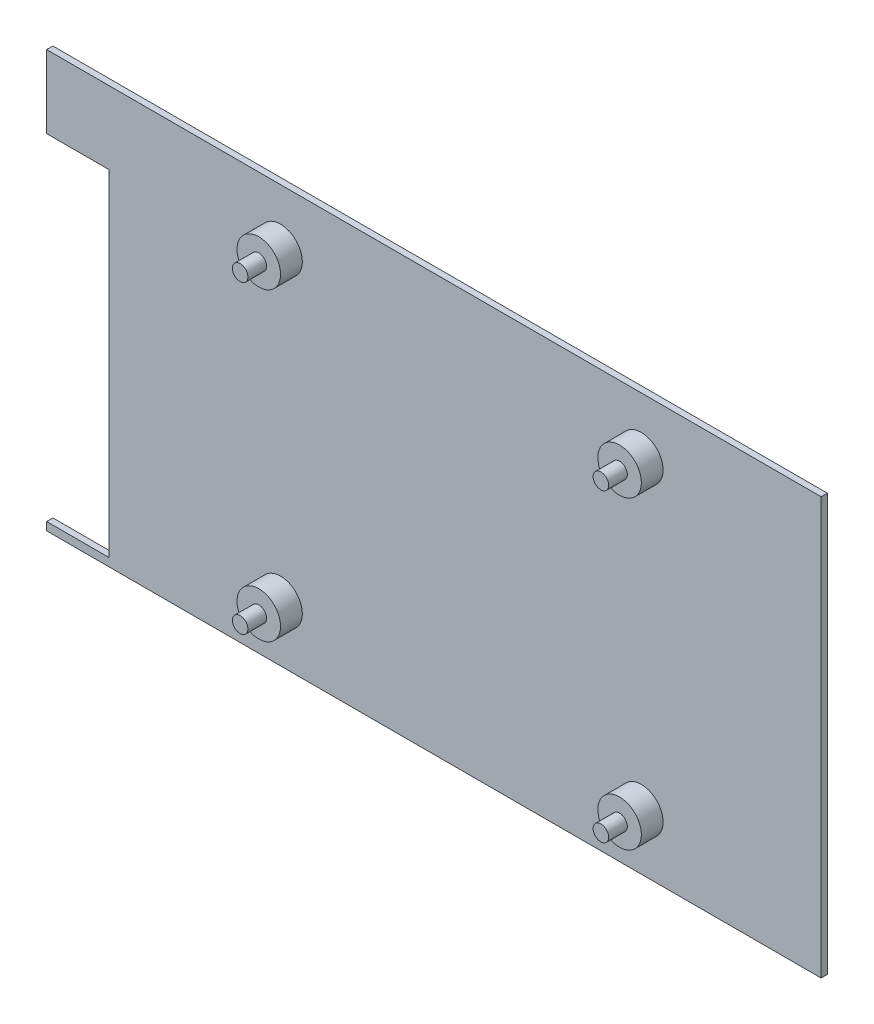
ISO-10303-21;
HEADER;
FILE_DESCRIPTION(('STEP AP214'),'2;1');
FILE_NAME('part.step','',(''),(''),'','','');
FILE_SCHEMA(('AUTOMOTIVE_DESIGN { 1 0 10303 214 1 1 1 1 }'));
ENDSEC;
DATA;
#1=APPLICATION_CONTEXT('core data for automotive mechanical design processes');
#2=APPLICATION_PROTOCOL_DEFINITION('international standard','automotive_design',2000,#1);
#3=PRODUCT_CONTEXT('',#1,'mechanical');
#4=PRODUCT('Part','Part','',(#3));
#5=PRODUCT_RELATED_PRODUCT_CATEGORY('part','',(#4));
#6=PRODUCT_DEFINITION_FORMATION('','',#4);
#7=PRODUCT_DEFINITION_CONTEXT('part definition',#1,'design');
#8=PRODUCT_DEFINITION('design','',#6,#7);
#9=PRODUCT_DEFINITION_SHAPE('','',#8);
#10=(LENGTH_UNIT() NAMED_UNIT(*) SI_UNIT(.MILLI.,.METRE.));
#11=(NAMED_UNIT(*) PLANE_ANGLE_UNIT() SI_UNIT($,.RADIAN.));
#12=(NAMED_UNIT(*) SI_UNIT($,.STERADIAN.) SOLID_ANGLE_UNIT());
#13=UNCERTAINTY_MEASURE_WITH_UNIT(LENGTH_MEASURE(1.E-05),#10,'distance_accuracy_value','');
#14=(GEOMETRIC_REPRESENTATION_CONTEXT(3) GLOBAL_UNCERTAINTY_ASSIGNED_CONTEXT((#13)) GLOBAL_UNIT_ASSIGNED_CONTEXT((#10,
#11,#12)) REPRESENTATION_CONTEXT('',''));
#15=CARTESIAN_POINT('',(0.,0.,0.));
#16=DIRECTION('',(0.,0.,1.));
#17=DIRECTION('',(1.,0.,0.));
#18=AXIS2_PLACEMENT_3D('',#15,#16,#17);
#19=CARTESIAN_POINT('',(-24.25,-24.5,4.5));
#20=DIRECTION('',(0.,0.,1.));
#21=DIRECTION('',(1.,0.,0.));
#22=AXIS2_PLACEMENT_3D('',#19,#20,#21);
#23=PLANE('',#22);
#24=CARTESIAN_POINT('',(-24.25,-24.5,4.5));
#25=DIRECTION('',(0.,0.,1.));
#26=DIRECTION('',(1.,0.,0.));
#27=AXIS2_PLACEMENT_3D('',#24,#25,#26);
#28=CIRCLE('',#27,3.5);
#29=CARTESIAN_POINT('',(-20.75,-24.5,4.5));
#30=VERTEX_POINT('',#29);
#31=EDGE_CURVE('E270',#30,#30,#28,.T.);
#32=ORIENTED_EDGE('',*,*,#31,.T.);
#33=EDGE_LOOP('',(#32));
#34=FACE_BOUND('',#33,.T.);
#35=CARTESIAN_POINT('',(-24.25,-24.5,4.5));
#36=DIRECTION('',(0.,0.,1.));
#37=DIRECTION('',(1.,0.,0.));
#38=AXIS2_PLACEMENT_3D('',#35,#36,#37);
#39=CIRCLE('',#38,1.25);
#40=CARTESIAN_POINT('',(-23.,-24.5,4.5));
#41=VERTEX_POINT('',#40);
#42=EDGE_CURVE('E250',#41,#41,#39,.T.);
#43=ORIENTED_EDGE('',*,*,#42,.F.);
#44=EDGE_LOOP('',(#43));
#45=FACE_BOUND('',#44,.T.);
#46=ADVANCED_FACE('F44',(#34,#45),#23,.T.);
#47=CARTESIAN_POINT('',(33.75,-24.5,4.5));
#48=DIRECTION('',(0.,0.,1.));
#49=DIRECTION('',(1.,0.,0.));
#50=AXIS2_PLACEMENT_3D('',#47,#48,#49);
#51=PLANE('',#50);
#52=CARTESIAN_POINT('',(33.75,-24.5,4.5));
#53=DIRECTION('',(0.,0.,1.));
#54=DIRECTION('',(1.,0.,0.));
#55=AXIS2_PLACEMENT_3D('',#52,#53,#54);
#56=CIRCLE('',#55,3.5);
#57=CARTESIAN_POINT('',(37.25,-24.5,4.5));
#58=VERTEX_POINT('',#57);
#59=EDGE_CURVE('E274',#58,#58,#56,.T.);
#60=ORIENTED_EDGE('',*,*,#59,.T.);
#61=EDGE_LOOP('',(#60));
#62=FACE_BOUND('',#61,.T.);
#63=CARTESIAN_POINT('',(33.75,-24.5,4.5));
#64=DIRECTION('',(0.,0.,1.));
#65=DIRECTION('',(1.,0.,0.));
#66=AXIS2_PLACEMENT_3D('',#63,#64,#65);
#67=CIRCLE('',#66,1.25);
#68=CARTESIAN_POINT('',(35.,-24.5,4.5));
#69=VERTEX_POINT('',#68);
#70=EDGE_CURVE('E249',#69,#69,#67,.T.);
#71=ORIENTED_EDGE('',*,*,#70,.F.);
#72=EDGE_LOOP('',(#71));
#73=FACE_BOUND('',#72,.T.);
#74=ADVANCED_FACE('F208',(#62,#73),#51,.T.);
#75=CARTESIAN_POINT('',(33.75,24.5,4.5));
#76=DIRECTION('',(0.,0.,1.));
#77=DIRECTION('',(1.,0.,0.));
#78=AXIS2_PLACEMENT_3D('',#75,#76,#77);
#79=PLANE('',#78);
#80=CARTESIAN_POINT('',(33.75,24.5,4.5));
#81=DIRECTION('',(0.,0.,1.));
#82=DIRECTION('',(1.,0.,0.));
#83=AXIS2_PLACEMENT_3D('',#80,#81,#82);
#84=CIRCLE('',#83,3.5);
#85=CARTESIAN_POINT('',(37.25,24.5,4.5));
#86=VERTEX_POINT('',#85);
#87=EDGE_CURVE('E277',#86,#86,#84,.T.);
#88=ORIENTED_EDGE('',*,*,#87,.T.);
#89=EDGE_LOOP('',(#88));
#90=FACE_BOUND('',#89,.T.);
#91=CARTESIAN_POINT('',(33.75,24.5,4.5));
#92=DIRECTION('',(0.,0.,1.));
#93=DIRECTION('',(1.,0.,0.));
#94=AXIS2_PLACEMENT_3D('',#91,#92,#93);
#95=CIRCLE('',#94,1.25);
#96=CARTESIAN_POINT('',(35.,24.5,4.5));
#97=VERTEX_POINT('',#96);
#98=EDGE_CURVE('E259',#97,#97,#95,.T.);
#99=ORIENTED_EDGE('',*,*,#98,.F.);
#100=EDGE_LOOP('',(#99));
#101=FACE_BOUND('',#100,.T.);
#102=ADVANCED_FACE('F213',(#90,#101),#79,.T.);
#103=CARTESIAN_POINT('',(-24.25,24.5,4.5));
#104=DIRECTION('',(0.,0.,1.));
#105=DIRECTION('',(1.,0.,0.));
#106=AXIS2_PLACEMENT_3D('',#103,#104,#105);
#107=PLANE('',#106);
#108=CARTESIAN_POINT('',(-24.25,24.5,4.5));
#109=DIRECTION('',(0.,0.,1.));
#110=DIRECTION('',(1.,0.,0.));
#111=AXIS2_PLACEMENT_3D('',#108,#109,#110);
#112=CIRCLE('',#111,3.5);
#113=CARTESIAN_POINT('',(-20.75,24.5,4.5));
#114=VERTEX_POINT('',#113);
#115=EDGE_CURVE('E147',#114,#114,#112,.T.);
#116=ORIENTED_EDGE('',*,*,#115,.T.);
#117=EDGE_LOOP('',(#116));
#118=FACE_BOUND('',#117,.T.);
#119=CARTESIAN_POINT('',(-24.25,24.5,4.5));
#120=DIRECTION('',(0.,0.,1.));
#121=DIRECTION('',(1.,0.,0.));
#122=AXIS2_PLACEMENT_3D('',#119,#120,#121);
#123=CIRCLE('',#122,1.25);
#124=CARTESIAN_POINT('',(-23.,24.5,4.5));
#125=VERTEX_POINT('',#124);
#126=EDGE_CURVE('E264',#125,#125,#123,.T.);
#127=ORIENTED_EDGE('',*,*,#126,.F.);
#128=EDGE_LOOP('',(#127));
#129=FACE_BOUND('',#128,.T.);
#130=ADVANCED_FACE('F185',(#118,#129),#107,.T.);
#131=CARTESIAN_POINT('',(0.,0.,1.));
#132=DIRECTION('',(0.,0.,-1.));
#133=DIRECTION('',(-1.,0.,0.));
#134=AXIS2_PLACEMENT_3D('',#131,#132,#133);
#135=PLANE('',#134);
#136=DIRECTION('',(0.,-1.,0.));
#137=VECTOR('',#136,1.);
#138=CARTESIAN_POINT('',(-61.85,-32.2,1.));
#139=LINE('',#138,#137);
#140=CARTESIAN_POINT('',(-61.85,-32.2,1.));
#141=VERTEX_POINT('',#140);
#142=CARTESIAN_POINT('',(-61.85,-33.5,1.));
#143=VERTEX_POINT('',#142);
#144=EDGE_CURVE('E158',#141,#143,#139,.T.);
#145=ORIENTED_EDGE('',*,*,#144,.T.);
#146=DIRECTION('',(1.,0.,0.));
#147=VECTOR('',#146,1.);
#148=CARTESIAN_POINT('',(62.65,-33.5,1.));
#149=LINE('',#148,#147);
#150=CARTESIAN_POINT('',(62.65,-33.5,1.));
#151=VERTEX_POINT('',#150);
#152=EDGE_CURVE('E105',#143,#151,#149,.T.);
#153=ORIENTED_EDGE('',*,*,#152,.T.);
#154=DIRECTION('',(0.,1.,0.));
#155=VECTOR('',#154,1.);
#156=CARTESIAN_POINT('',(62.65,33.5,1.));
#157=LINE('',#156,#155);
#158=CARTESIAN_POINT('',(62.65,33.5,1.));
#159=VERTEX_POINT('',#158);
#160=EDGE_CURVE('E284',#151,#159,#157,.T.);
#161=ORIENTED_EDGE('',*,*,#160,.T.);
#162=DIRECTION('',(-1.,0.,0.));
#163=VECTOR('',#162,1.);
#164=CARTESIAN_POINT('',(62.65,33.5,1.));
#165=LINE('',#164,#163);
#166=CARTESIAN_POINT('',(-61.85,33.5,1.));
#167=VERTEX_POINT('',#166);
#168=EDGE_CURVE('E286',#159,#167,#165,.T.);
#169=ORIENTED_EDGE('',*,*,#168,.T.);
#170=DIRECTION('',(0.,-1.,0.));
#171=VECTOR('',#170,1.);
#172=CARTESIAN_POINT('',(-61.85,33.5,1.));
#173=LINE('',#172,#171);
#174=CARTESIAN_POINT('',(-61.85,21.8,1.));
#175=VERTEX_POINT('',#174);
#176=EDGE_CURVE('E125',#167,#175,#173,.T.);
#177=ORIENTED_EDGE('',*,*,#176,.T.);
#178=DIRECTION('',(1.,0.,0.));
#179=VECTOR('',#178,1.);
#180=CARTESIAN_POINT('',(-61.85,21.8,1.));
#181=LINE('',#180,#179);
#182=CARTESIAN_POINT('',(-51.85,21.8,1.));
#183=VERTEX_POINT('',#182);
#184=EDGE_CURVE('E118',#175,#183,#181,.T.);
#185=ORIENTED_EDGE('',*,*,#184,.T.);
#186=DIRECTION('',(0.,-1.,0.));
#187=VECTOR('',#186,1.);
#188=CARTESIAN_POINT('',(-51.85,21.8,1.));
#189=LINE('',#188,#187);
#190=CARTESIAN_POINT('',(-51.85,-32.2,1.));
#191=VERTEX_POINT('',#190);
#192=EDGE_CURVE('E123',#183,#191,#189,.T.);
#193=ORIENTED_EDGE('',*,*,#192,.T.);
#194=DIRECTION('',(-1.,0.,0.));
#195=VECTOR('',#194,1.);
#196=CARTESIAN_POINT('',(-51.85,-32.2,1.));
#197=LINE('',#196,#195);
#198=EDGE_CURVE('E61',#191,#141,#197,.T.);
#199=ORIENTED_EDGE('',*,*,#198,.T.);
#200=EDGE_LOOP('',(#145,#153,#161,#169,#177,#185,#193,#199));
#201=FACE_BOUND('',#200,.T.);
#202=CARTESIAN_POINT('',(-24.25,24.5,1.));
#203=DIRECTION('',(0.,0.,-1.));
#204=DIRECTION('',(-1.,0.,0.));
#205=AXIS2_PLACEMENT_3D('',#202,#203,#204);
#206=CIRCLE('',#205,3.5);
#207=CARTESIAN_POINT('',(-27.75,24.5,1.));
#208=VERTEX_POINT('',#207);
#209=EDGE_CURVE('E173',#208,#208,#206,.F.);
#210=ORIENTED_EDGE('',*,*,#209,.F.);
#211=EDGE_LOOP('',(#210));
#212=FACE_BOUND('',#211,.T.);
#213=CARTESIAN_POINT('',(33.75,24.5,1.));
#214=DIRECTION('',(0.,0.,-1.));
#215=DIRECTION('',(-1.,0.,0.));
#216=AXIS2_PLACEMENT_3D('',#213,#214,#215);
#217=CIRCLE('',#216,3.5);
#218=CARTESIAN_POINT('',(30.25,24.5,1.));
#219=VERTEX_POINT('',#218);
#220=EDGE_CURVE('E176',#219,#219,#217,.F.);
#221=ORIENTED_EDGE('',*,*,#220,.F.);
#222=EDGE_LOOP('',(#221));
#223=FACE_BOUND('',#222,.T.);
#224=CARTESIAN_POINT('',(33.75,-24.5,1.));
#225=DIRECTION('',(0.,0.,-1.));
#226=DIRECTION('',(-1.,0.,0.));
#227=AXIS2_PLACEMENT_3D('',#224,#225,#226);
#228=CIRCLE('',#227,3.5);
#229=CARTESIAN_POINT('',(30.25,-24.5,1.));
#230=VERTEX_POINT('',#229);
#231=EDGE_CURVE('E53',#230,#230,#228,.F.);
#232=ORIENTED_EDGE('',*,*,#231,.F.);
#233=EDGE_LOOP('',(#232));
#234=FACE_BOUND('',#233,.T.);
#235=CARTESIAN_POINT('',(-24.25,-24.5,1.));
#236=DIRECTION('',(0.,0.,-1.));
#237=DIRECTION('',(-1.,0.,0.));
#238=AXIS2_PLACEMENT_3D('',#235,#236,#237);
#239=CIRCLE('',#238,3.5);
#240=CARTESIAN_POINT('',(-27.75,-24.5,1.));
#241=VERTEX_POINT('',#240);
#242=EDGE_CURVE('E13',#241,#241,#239,.F.);
#243=ORIENTED_EDGE('',*,*,#242,.F.);
#244=EDGE_LOOP('',(#243));
#245=FACE_BOUND('',#244,.T.);
#246=ADVANCED_FACE('F120',(#201,#212,#223,#234,#245),#135,.F.);
#247=CARTESIAN_POINT('',(-61.85,-32.2,1.));
#248=DIRECTION('',(1.,0.,0.));
#249=DIRECTION('',(0.,1.,0.));
#250=AXIS2_PLACEMENT_3D('',#247,#248,#249);
#251=PLANE('',#250);
#252=DIRECTION('',(0.,-1.,0.));
#253=VECTOR('',#252,1.);
#254=CARTESIAN_POINT('',(-61.85,-32.2,0.));
#255=LINE('',#254,#253);
#256=CARTESIAN_POINT('',(-61.85,-32.2,0.));
#257=VERTEX_POINT('',#256);
#258=CARTESIAN_POINT('',(-61.85,-33.5,0.));
#259=VERTEX_POINT('',#258);
#260=EDGE_CURVE('E143',#257,#259,#255,.T.);
#261=ORIENTED_EDGE('',*,*,#260,.T.);
#262=DIRECTION('',(0.,0.,-1.));
#263=VECTOR('',#262,1.);
#264=CARTESIAN_POINT('',(-61.85,-33.5,1.));
#265=LINE('',#264,#263);
#266=EDGE_CURVE('E171',#143,#259,#265,.T.);
#267=ORIENTED_EDGE('',*,*,#266,.F.);
#268=ORIENTED_EDGE('',*,*,#144,.F.);
#269=DIRECTION('',(0.,0.,-1.));
#270=VECTOR('',#269,1.);
#271=CARTESIAN_POINT('',(-61.85,-32.2,1.));
#272=LINE('',#271,#270);
#273=EDGE_CURVE('E139',#141,#257,#272,.T.);
#274=ORIENTED_EDGE('',*,*,#273,.T.);
#275=EDGE_LOOP('',(#261,#267,#268,#274));
#276=FACE_BOUND('',#275,.T.);
#277=ADVANCED_FACE('F46',(#276),#251,.F.);
#278=CARTESIAN_POINT('',(62.65,-33.5,1.));
#279=DIRECTION('',(0.,1.,0.));
#280=DIRECTION('',(-1.,0.,0.));
#281=AXIS2_PLACEMENT_3D('',#278,#279,#280);
#282=PLANE('',#281);
#283=DIRECTION('',(1.,0.,0.));
#284=VECTOR('',#283,1.);
#285=CARTESIAN_POINT('',(62.65,-33.5,0.));
#286=LINE('',#285,#284);
#287=CARTESIAN_POINT('',(62.65,-33.5,0.));
#288=VERTEX_POINT('',#287);
#289=EDGE_CURVE('E146',#259,#288,#286,.T.);
#290=ORIENTED_EDGE('',*,*,#289,.T.);
#291=DIRECTION('',(0.,0.,-1.));
#292=VECTOR('',#291,1.);
#293=CARTESIAN_POINT('',(62.65,-33.5,1.));
#294=LINE('',#293,#292);
#295=EDGE_CURVE('E168',#151,#288,#294,.T.);
#296=ORIENTED_EDGE('',*,*,#295,.F.);
#297=ORIENTED_EDGE('',*,*,#152,.F.);
#298=ORIENTED_EDGE('',*,*,#266,.T.);
#299=EDGE_LOOP('',(#290,#296,#297,#298));
#300=FACE_BOUND('',#299,.T.);
#301=ADVANCED_FACE('F323',(#300),#282,.F.);
#302=CARTESIAN_POINT('',(62.65,33.5,1.));
#303=DIRECTION('',(-1.,0.,0.));
#304=DIRECTION('',(0.,-1.,0.));
#305=AXIS2_PLACEMENT_3D('',#302,#303,#304);
#306=PLANE('',#305);
#307=DIRECTION('',(0.,1.,0.));
#308=VECTOR('',#307,1.);
#309=CARTESIAN_POINT('',(62.65,33.5,0.));
#310=LINE('',#309,#308);
#311=CARTESIAN_POINT('',(62.65,33.5,0.));
#312=VERTEX_POINT('',#311);
#313=EDGE_CURVE('E149',#288,#312,#310,.T.);
#314=ORIENTED_EDGE('',*,*,#313,.T.);
#315=DIRECTION('',(0.,0.,-1.));
#316=VECTOR('',#315,1.);
#317=CARTESIAN_POINT('',(62.65,33.5,1.));
#318=LINE('',#317,#316);
#319=EDGE_CURVE('E165',#159,#312,#318,.T.);
#320=ORIENTED_EDGE('',*,*,#319,.F.);
#321=ORIENTED_EDGE('',*,*,#160,.F.);
#322=ORIENTED_EDGE('',*,*,#295,.T.);
#323=EDGE_LOOP('',(#314,#320,#321,#322));
#324=FACE_BOUND('',#323,.T.);
#325=ADVANCED_FACE('F321',(#324),#306,.F.);
#326=CARTESIAN_POINT('',(62.65,33.5,1.));
#327=DIRECTION('',(0.,-1.,0.));
#328=DIRECTION('',(1.,0.,0.));
#329=AXIS2_PLACEMENT_3D('',#326,#327,#328);
#330=PLANE('',#329);
#331=DIRECTION('',(-1.,0.,0.));
#332=VECTOR('',#331,1.);
#333=CARTESIAN_POINT('',(62.65,33.5,0.));
#334=LINE('',#333,#332);
#335=CARTESIAN_POINT('',(-61.85,33.5,0.));
#336=VERTEX_POINT('',#335);
#337=EDGE_CURVE('E151',#312,#336,#334,.T.);
#338=ORIENTED_EDGE('',*,*,#337,.T.);
#339=DIRECTION('',(0.,0.,-1.));
#340=VECTOR('',#339,1.);
#341=CARTESIAN_POINT('',(-61.85,33.5,1.));
#342=LINE('',#341,#340);
#343=EDGE_CURVE('E162',#167,#336,#342,.T.);
#344=ORIENTED_EDGE('',*,*,#343,.F.);
#345=ORIENTED_EDGE('',*,*,#168,.F.);
#346=ORIENTED_EDGE('',*,*,#319,.T.);
#347=EDGE_LOOP('',(#338,#344,#345,#346));
#348=FACE_BOUND('',#347,.T.);
#349=ADVANCED_FACE('F292',(#348),#330,.F.);
#350=CARTESIAN_POINT('',(-61.85,33.5,1.));
#351=DIRECTION('',(1.,0.,0.));
#352=DIRECTION('',(0.,1.,0.));
#353=AXIS2_PLACEMENT_3D('',#350,#351,#352);
#354=PLANE('',#353);
#355=DIRECTION('',(0.,-1.,0.));
#356=VECTOR('',#355,1.);
#357=CARTESIAN_POINT('',(-61.85,33.5,0.));
#358=LINE('',#357,#356);
#359=CARTESIAN_POINT('',(-61.85,21.8,0.));
#360=VERTEX_POINT('',#359);
#361=EDGE_CURVE('E153',#336,#360,#358,.T.);
#362=ORIENTED_EDGE('',*,*,#361,.T.);
#363=DIRECTION('',(0.,0.,-1.));
#364=VECTOR('',#363,1.);
#365=CARTESIAN_POINT('',(-61.85,21.8,1.));
#366=LINE('',#365,#364);
#367=EDGE_CURVE('E134',#175,#360,#366,.T.);
#368=ORIENTED_EDGE('',*,*,#367,.F.);
#369=ORIENTED_EDGE('',*,*,#176,.F.);
#370=ORIENTED_EDGE('',*,*,#343,.T.);
#371=EDGE_LOOP('',(#362,#368,#369,#370));
#372=FACE_BOUND('',#371,.T.);
#373=ADVANCED_FACE('F296',(#372),#354,.F.);
#374=CARTESIAN_POINT('',(-61.85,21.8,1.));
#375=DIRECTION('',(0.,1.,0.));
#376=DIRECTION('',(-1.,0.,0.));
#377=AXIS2_PLACEMENT_3D('',#374,#375,#376);
#378=PLANE('',#377);
#379=DIRECTION('',(1.,0.,0.));
#380=VECTOR('',#379,1.);
#381=CARTESIAN_POINT('',(-61.85,21.8,0.));
#382=LINE('',#381,#380);
#383=CARTESIAN_POINT('',(-51.85,21.8,0.));
#384=VERTEX_POINT('',#383);
#385=EDGE_CURVE('E133',#360,#384,#382,.T.);
#386=ORIENTED_EDGE('',*,*,#385,.T.);
#387=DIRECTION('',(0.,0.,-1.));
#388=VECTOR('',#387,1.);
#389=CARTESIAN_POINT('',(-51.85,21.8,1.));
#390=LINE('',#389,#388);
#391=EDGE_CURVE('E130',#183,#384,#390,.T.);
#392=ORIENTED_EDGE('',*,*,#391,.F.);
#393=ORIENTED_EDGE('',*,*,#184,.F.);
#394=ORIENTED_EDGE('',*,*,#367,.T.);
#395=EDGE_LOOP('',(#386,#392,#393,#394));
#396=FACE_BOUND('',#395,.T.);
#397=ADVANCED_FACE('F131',(#396),#378,.F.);
#398=CARTESIAN_POINT('',(-51.85,21.8,1.));
#399=DIRECTION('',(1.,0.,0.));
#400=DIRECTION('',(0.,1.,0.));
#401=AXIS2_PLACEMENT_3D('',#398,#399,#400);
#402=PLANE('',#401);
#403=DIRECTION('',(0.,-1.,0.));
#404=VECTOR('',#403,1.);
#405=CARTESIAN_POINT('',(-51.85,21.8,0.));
#406=LINE('',#405,#404);
#407=CARTESIAN_POINT('',(-51.85,-32.2,0.));
#408=VERTEX_POINT('',#407);
#409=EDGE_CURVE('E90',#384,#408,#406,.T.);
#410=ORIENTED_EDGE('',*,*,#409,.T.);
#411=DIRECTION('',(0.,0.,-1.));
#412=VECTOR('',#411,1.);
#413=CARTESIAN_POINT('',(-51.85,-32.2,1.));
#414=LINE('',#413,#412);
#415=EDGE_CURVE('E135',#191,#408,#414,.T.);
#416=ORIENTED_EDGE('',*,*,#415,.F.);
#417=ORIENTED_EDGE('',*,*,#192,.F.);
#418=ORIENTED_EDGE('',*,*,#391,.T.);
#419=EDGE_LOOP('',(#410,#416,#417,#418));
#420=FACE_BOUND('',#419,.T.);
#421=ADVANCED_FACE('F137',(#420),#402,.F.);
#422=CARTESIAN_POINT('',(-51.85,-32.2,1.));
#423=DIRECTION('',(0.,-1.,0.));
#424=DIRECTION('',(0.,0.,-1.));
#425=AXIS2_PLACEMENT_3D('',#422,#423,#424);
#426=PLANE('',#425);
#427=DIRECTION('',(-1.,0.,0.));
#428=VECTOR('',#427,1.);
#429=CARTESIAN_POINT('',(-51.85,-32.2,0.));
#430=LINE('',#429,#428);
#431=EDGE_CURVE('E96',#408,#257,#430,.T.);
#432=ORIENTED_EDGE('',*,*,#431,.T.);
#433=ORIENTED_EDGE('',*,*,#273,.F.);
#434=ORIENTED_EDGE('',*,*,#198,.F.);
#435=ORIENTED_EDGE('',*,*,#415,.T.);
#436=EDGE_LOOP('',(#432,#433,#434,#435));
#437=FACE_BOUND('',#436,.T.);
#438=ADVANCED_FACE('F304',(#437),#426,.F.);
#439=CARTESIAN_POINT('',(0.,0.,0.));
#440=DIRECTION('',(0.,0.,-1.));
#441=DIRECTION('',(-1.,0.,0.));
#442=AXIS2_PLACEMENT_3D('',#439,#440,#441);
#443=PLANE('',#442);
#444=ORIENTED_EDGE('',*,*,#260,.F.);
#445=ORIENTED_EDGE('',*,*,#431,.F.);
#446=ORIENTED_EDGE('',*,*,#409,.F.);
#447=ORIENTED_EDGE('',*,*,#385,.F.);
#448=ORIENTED_EDGE('',*,*,#361,.F.);
#449=ORIENTED_EDGE('',*,*,#337,.F.);
#450=ORIENTED_EDGE('',*,*,#313,.F.);
#451=ORIENTED_EDGE('',*,*,#289,.F.);
#452=EDGE_LOOP('',(#444,#445,#446,#447,#448,#449,#450,#451));
#453=FACE_BOUND('',#452,.T.);
#454=ADVANCED_FACE('F299',(#453),#443,.T.);
#455=CARTESIAN_POINT('',(-24.25,24.5,4.5));
#456=DIRECTION('',(0.,0.,-1.));
#457=DIRECTION('',(-1.,0.,0.));
#458=AXIS2_PLACEMENT_3D('',#455,#456,#457);
#459=CYLINDRICAL_SURFACE('',#458,3.5);
#460=ORIENTED_EDGE('',*,*,#115,.F.);
#461=EDGE_LOOP('',(#460));
#462=FACE_BOUND('',#461,.T.);
#463=ORIENTED_EDGE('',*,*,#209,.T.);
#464=EDGE_LOOP('',(#463));
#465=FACE_BOUND('',#464,.T.);
#466=ADVANCED_FACE('F311',(#462,#465),#459,.T.);
#467=CARTESIAN_POINT('',(33.75,24.5,4.5));
#468=DIRECTION('',(0.,0.,-1.));
#469=DIRECTION('',(-1.,0.,0.));
#470=AXIS2_PLACEMENT_3D('',#467,#468,#469);
#471=CYLINDRICAL_SURFACE('',#470,3.5);
#472=ORIENTED_EDGE('',*,*,#87,.F.);
#473=EDGE_LOOP('',(#472));
#474=FACE_BOUND('',#473,.T.);
#475=ORIENTED_EDGE('',*,*,#220,.T.);
#476=EDGE_LOOP('',(#475));
#477=FACE_BOUND('',#476,.T.);
#478=ADVANCED_FACE('F201',(#474,#477),#471,.T.);
#479=CARTESIAN_POINT('',(33.75,-24.5,4.5));
#480=DIRECTION('',(0.,0.,-1.));
#481=DIRECTION('',(-1.,0.,0.));
#482=AXIS2_PLACEMENT_3D('',#479,#480,#481);
#483=CYLINDRICAL_SURFACE('',#482,3.5);
#484=ORIENTED_EDGE('',*,*,#59,.F.);
#485=EDGE_LOOP('',(#484));
#486=FACE_BOUND('',#485,.T.);
#487=ORIENTED_EDGE('',*,*,#231,.T.);
#488=EDGE_LOOP('',(#487));
#489=FACE_BOUND('',#488,.T.);
#490=ADVANCED_FACE('F181',(#486,#489),#483,.T.);
#491=CARTESIAN_POINT('',(-24.25,-24.5,4.5));
#492=DIRECTION('',(0.,0.,-1.));
#493=DIRECTION('',(-1.,0.,0.));
#494=AXIS2_PLACEMENT_3D('',#491,#492,#493);
#495=CYLINDRICAL_SURFACE('',#494,3.5);
#496=ORIENTED_EDGE('',*,*,#31,.F.);
#497=EDGE_LOOP('',(#496));
#498=FACE_BOUND('',#497,.T.);
#499=ORIENTED_EDGE('',*,*,#242,.T.);
#500=EDGE_LOOP('',(#499));
#501=FACE_BOUND('',#500,.T.);
#502=ADVANCED_FACE('F189',(#498,#501),#495,.T.);
#503=CARTESIAN_POINT('',(-24.25,24.5,7.5));
#504=DIRECTION('',(0.,0.,-1.));
#505=DIRECTION('',(-1.,0.,0.));
#506=AXIS2_PLACEMENT_3D('',#503,#504,#505);
#507=CYLINDRICAL_SURFACE('',#506,1.25);
#508=CARTESIAN_POINT('',(-24.25,24.5,7.5));
#509=DIRECTION('',(0.,0.,1.));
#510=DIRECTION('',(1.,0.,0.));
#511=AXIS2_PLACEMENT_3D('',#508,#509,#510);
#512=CIRCLE('',#511,1.25);
#513=CARTESIAN_POINT('',(-23.,24.5,7.5));
#514=VERTEX_POINT('',#513);
#515=EDGE_CURVE('E267',#514,#514,#512,.T.);
#516=ORIENTED_EDGE('',*,*,#515,.F.);
#517=EDGE_LOOP('',(#516));
#518=FACE_BOUND('',#517,.T.);
#519=ORIENTED_EDGE('',*,*,#126,.T.);
#520=EDGE_LOOP('',(#519));
#521=FACE_BOUND('',#520,.T.);
#522=ADVANCED_FACE('F191',(#518,#521),#507,.T.);
#523=CARTESIAN_POINT('',(-24.25,24.5,7.5));
#524=DIRECTION('',(0.,0.,1.));
#525=DIRECTION('',(1.,0.,0.));
#526=AXIS2_PLACEMENT_3D('',#523,#524,#525);
#527=PLANE('',#526);
#528=ORIENTED_EDGE('',*,*,#515,.T.);
#529=EDGE_LOOP('',(#528));
#530=FACE_BOUND('',#529,.T.);
#531=ADVANCED_FACE('F198',(#530),#527,.T.);
#532=CARTESIAN_POINT('',(33.75,24.5,7.5));
#533=DIRECTION('',(0.,0.,-1.));
#534=DIRECTION('',(-1.,0.,0.));
#535=AXIS2_PLACEMENT_3D('',#532,#533,#534);
#536=CYLINDRICAL_SURFACE('',#535,1.25);
#537=CARTESIAN_POINT('',(33.75,24.5,7.5));
#538=DIRECTION('',(0.,0.,1.));
#539=DIRECTION('',(1.,0.,0.));
#540=AXIS2_PLACEMENT_3D('',#537,#538,#539);
#541=CIRCLE('',#540,1.25);
#542=CARTESIAN_POINT('',(35.,24.5,7.5));
#543=VERTEX_POINT('',#542);
#544=EDGE_CURVE('E261',#543,#543,#541,.T.);
#545=ORIENTED_EDGE('',*,*,#544,.F.);
#546=EDGE_LOOP('',(#545));
#547=FACE_BOUND('',#546,.T.);
#548=ORIENTED_EDGE('',*,*,#98,.T.);
#549=EDGE_LOOP('',(#548));
#550=FACE_BOUND('',#549,.T.);
#551=ADVANCED_FACE('F220',(#547,#550),#536,.T.);
#552=CARTESIAN_POINT('',(33.75,24.5,7.5));
#553=DIRECTION('',(0.,0.,1.));
#554=DIRECTION('',(1.,0.,0.));
#555=AXIS2_PLACEMENT_3D('',#552,#553,#554);
#556=PLANE('',#555);
#557=ORIENTED_EDGE('',*,*,#544,.T.);
#558=EDGE_LOOP('',(#557));
#559=FACE_BOUND('',#558,.T.);
#560=ADVANCED_FACE('F224',(#559),#556,.T.);
#561=CARTESIAN_POINT('',(33.75,-24.5,7.5));
#562=DIRECTION('',(0.,0.,-1.));
#563=DIRECTION('',(-1.,0.,0.));
#564=AXIS2_PLACEMENT_3D('',#561,#562,#563);
#565=CYLINDRICAL_SURFACE('',#564,1.25);
#566=CARTESIAN_POINT('',(33.75,-24.5,7.5));
#567=DIRECTION('',(0.,0.,1.));
#568=DIRECTION('',(1.,0.,0.));
#569=AXIS2_PLACEMENT_3D('',#566,#567,#568);
#570=CIRCLE('',#569,1.25);
#571=CARTESIAN_POINT('',(35.,-24.5,7.5));
#572=VERTEX_POINT('',#571);
#573=EDGE_CURVE('E253',#572,#572,#570,.T.);
#574=ORIENTED_EDGE('',*,*,#573,.F.);
#575=EDGE_LOOP('',(#574));
#576=FACE_BOUND('',#575,.T.);
#577=ORIENTED_EDGE('',*,*,#70,.T.);
#578=EDGE_LOOP('',(#577));
#579=FACE_BOUND('',#578,.T.);
#580=ADVANCED_FACE('F228',(#576,#579),#565,.T.);
#581=CARTESIAN_POINT('',(33.75,-24.5,7.5));
#582=DIRECTION('',(0.,0.,1.));
#583=DIRECTION('',(1.,0.,0.));
#584=AXIS2_PLACEMENT_3D('',#581,#582,#583);
#585=PLANE('',#584);
#586=ORIENTED_EDGE('',*,*,#573,.T.);
#587=EDGE_LOOP('',(#586));
#588=FACE_BOUND('',#587,.T.);
#589=ADVANCED_FACE('F232',(#588),#585,.T.);
#590=CARTESIAN_POINT('',(-24.25,-24.5,7.5));
#591=DIRECTION('',(0.,0.,-1.));
#592=DIRECTION('',(-1.,0.,0.));
#593=AXIS2_PLACEMENT_3D('',#590,#591,#592);
#594=CYLINDRICAL_SURFACE('',#593,1.25);
#595=CARTESIAN_POINT('',(-24.25,-24.5,7.5));
#596=DIRECTION('',(0.,0.,1.));
#597=DIRECTION('',(1.,0.,0.));
#598=AXIS2_PLACEMENT_3D('',#595,#596,#597);
#599=CIRCLE('',#598,1.25);
#600=CARTESIAN_POINT('',(-23.,-24.5,7.5));
#601=VERTEX_POINT('',#600);
#602=EDGE_CURVE('E248',#601,#601,#599,.T.);
#603=ORIENTED_EDGE('',*,*,#602,.F.);
#604=EDGE_LOOP('',(#603));
#605=FACE_BOUND('',#604,.T.);
#606=ORIENTED_EDGE('',*,*,#42,.T.);
#607=EDGE_LOOP('',(#606));
#608=FACE_BOUND('',#607,.T.);
#609=ADVANCED_FACE('F236',(#605,#608),#594,.T.);
#610=CARTESIAN_POINT('',(-24.25,-24.5,7.5));
#611=DIRECTION('',(0.,0.,1.));
#612=DIRECTION('',(1.,0.,0.));
#613=AXIS2_PLACEMENT_3D('',#610,#611,#612);
#614=PLANE('',#613);
#615=ORIENTED_EDGE('',*,*,#602,.T.);
#616=EDGE_LOOP('',(#615));
#617=FACE_BOUND('',#616,.T.);
#618=ADVANCED_FACE('F240',(#617),#614,.T.);
#619=CLOSED_SHELL('',(#46,#74,#102,#130,#246,#277,#301,#325,#349,#373,#397,#421,#438,#454,#466,
#478,#490,#502,#522,#531,#551,#560,#580,#589,#609,#618));
#620=MANIFOLD_SOLID_BREP('B2',#619);
#621=ADVANCED_BREP_SHAPE_REPRESENTATION('',(#18,#620),#14);
#622=SHAPE_DEFINITION_REPRESENTATION(#9,#621);
ENDSEC;
END-ISO-10303-21;
